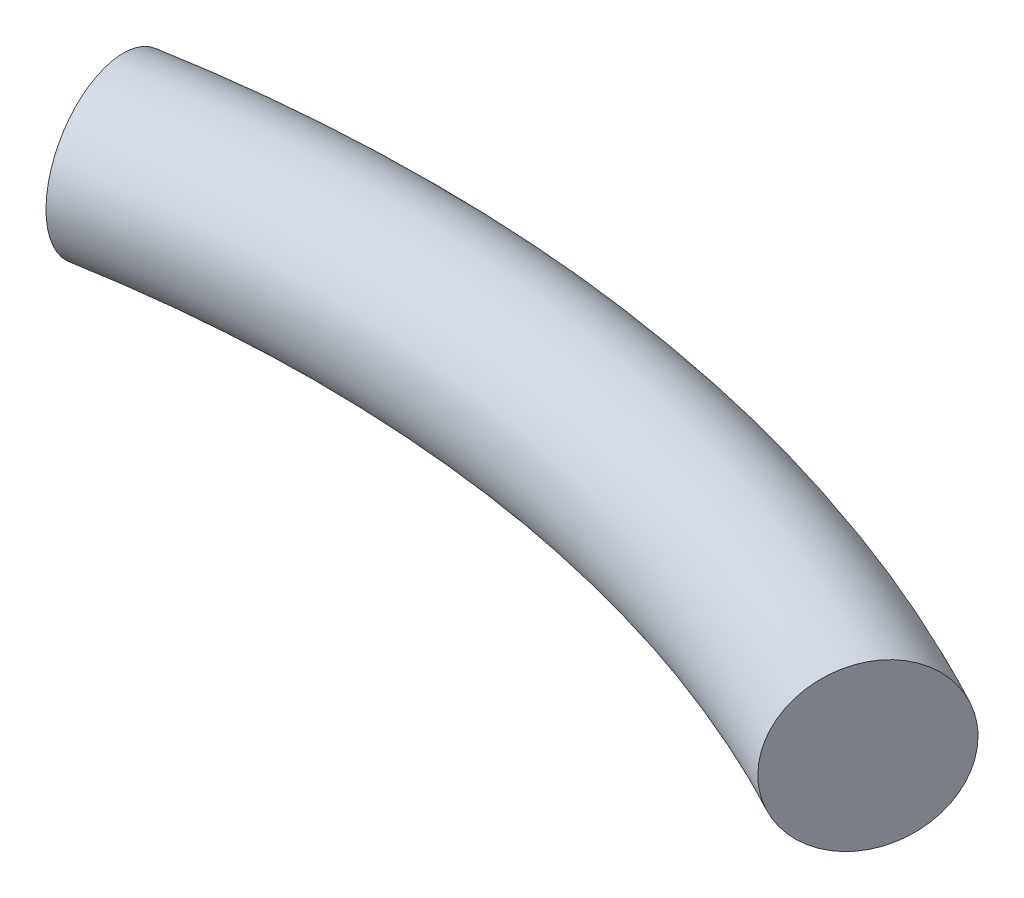
ISO-10303-21;
HEADER;
FILE_DESCRIPTION(('STEP AP214'),'2;1');
FILE_NAME('part.step','',(''),(''),'','','');
FILE_SCHEMA(('AUTOMOTIVE_DESIGN { 1 0 10303 214 1 1 1 1 }'));
ENDSEC;
DATA;
#1=APPLICATION_CONTEXT('core data for automotive mechanical design processes');
#2=APPLICATION_PROTOCOL_DEFINITION('international standard','automotive_design',2000,#1);
#3=PRODUCT_CONTEXT('',#1,'mechanical');
#4=PRODUCT('Part','Part','',(#3));
#5=PRODUCT_RELATED_PRODUCT_CATEGORY('part','',(#4));
#6=PRODUCT_DEFINITION_FORMATION('','',#4);
#7=PRODUCT_DEFINITION_CONTEXT('part definition',#1,'design');
#8=PRODUCT_DEFINITION('design','',#6,#7);
#9=PRODUCT_DEFINITION_SHAPE('','',#8);
#10=(LENGTH_UNIT() NAMED_UNIT(*) SI_UNIT(.MILLI.,.METRE.));
#11=(NAMED_UNIT(*) PLANE_ANGLE_UNIT() SI_UNIT($,.RADIAN.));
#12=(NAMED_UNIT(*) SI_UNIT($,.STERADIAN.) SOLID_ANGLE_UNIT());
#13=UNCERTAINTY_MEASURE_WITH_UNIT(LENGTH_MEASURE(1.E-05),#10,'distance_accuracy_value','');
#14=(GEOMETRIC_REPRESENTATION_CONTEXT(3) GLOBAL_UNCERTAINTY_ASSIGNED_CONTEXT((#13)) GLOBAL_UNIT_ASSIGNED_CONTEXT((#10,
#11,#12)) REPRESENTATION_CONTEXT('',''));
#15=CARTESIAN_POINT('',(0.,0.,0.));
#16=DIRECTION('',(0.,0.,1.));
#17=DIRECTION('',(1.,0.,0.));
#18=AXIS2_PLACEMENT_3D('',#15,#16,#17);
#19=CARTESIAN_POINT('',(0.,6.,0.));
#20=DIRECTION('',(-0.984807753012213,0.,0.173648177666902));
#21=DIRECTION('',(0.173648177666902,0.,0.984807753012213));
#22=AXIS2_PLACEMENT_3D('',#19,#20,#21);
#23=PLANE('',#22);
#24=CARTESIAN_POINT('',(-1.26106359712091,0.7302,-7.15184705173472));
#25=CARTESIAN_POINT('',(-1.26106327662223,0.75265524155964,-7.15184523409641));
#26=CARTESIAN_POINT('',(-1.26073403933574,0.775130857259379,-7.1499780366592));
#27=CARTESIAN_POINT('',(-1.25942422654595,0.819482451297505,-7.14254971919732));
#28=CARTESIAN_POINT('',(-1.25844225703204,0.841357041711003,-7.13698069334567));
#29=CARTESIAN_POINT('',(-1.25585623468071,0.883809618347233,-7.12231463179948));
#30=CARTESIAN_POINT('',(-1.25425329215272,0.904389843003349,-7.11322389298259));
#31=CARTESIAN_POINT('',(-1.25046785263389,0.943737337222425,-7.09175559866015));
#32=CARTESIAN_POINT('',(-1.24828453348019,0.962501982989582,-7.07937338043739));
#33=CARTESIAN_POINT('',(-1.24340496630295,0.997627484938171,-7.05169997981749));
#34=CARTESIAN_POINT('',(-1.24070944588194,1.01399169330263,-7.03641292385937));
#35=CARTESIAN_POINT('',(-1.23487576725396,1.0439048849067,-7.00332848831499));
#36=CARTESIAN_POINT('',(-1.23173699468016,1.05744989503907,-6.98552762448131));
#37=CARTESIAN_POINT('',(-1.22511134048583,1.08130194187445,-6.94795167230596));
#38=CARTESIAN_POINT('',(-1.22162471407894,1.09161132980011,-6.92817803135275));
#39=CARTESIAN_POINT('',(-1.21440018706302,1.10871348302438,-6.887205702632));
#40=CARTESIAN_POINT('',(-1.21066227168595,1.11550604143746,-6.86600693111075));
#41=CARTESIAN_POINT('',(-1.20304158246565,1.12538061292917,-6.8227878548827));
#42=CARTESIAN_POINT('',(-1.19915881288573,1.12846273512374,-6.80076757435434));
#43=CARTESIAN_POINT('',(-1.19135853067205,1.1308293161772,-6.75652997564802));
#44=CARTESIAN_POINT('',(-1.1874410180383,1.13011377503607,-6.73431265747006));
#45=CARTESIAN_POINT('',(-1.17968234063501,1.12490525493437,-6.69031101136852));
#46=CARTESIAN_POINT('',(-1.17584117811422,1.12041216488209,-6.66852669619815));
#47=CARTESIAN_POINT('',(-1.16834459228121,1.10777635092602,-6.62601144525419));
#48=CARTESIAN_POINT('',(-1.16468915805763,1.09963384169881,-6.6052804475992));
#49=CARTESIAN_POINT('',(-1.15766496832465,1.07992311451522,-6.56544428806902));
#50=CARTESIAN_POINT('',(-1.15429642371465,1.06835240391896,-6.54634032226375));
#51=CARTESIAN_POINT('',(-1.14794923103057,1.04213485030234,-6.5103436037889));
#52=CARTESIAN_POINT('',(-1.14497004448574,1.02749233015651,-6.49344779729995));
#53=CARTESIAN_POINT('',(-1.13947657535798,0.99551397474831,-6.46229278570906));
#54=CARTESIAN_POINT('',(-1.13696295518431,0.97817436557765,-6.4480373373167));
#55=CARTESIAN_POINT('',(-1.13248052046677,0.941335318357767,-6.42261618679547));
#56=CARTESIAN_POINT('',(-1.13051093618635,0.921838987081607,-6.41144611927374));
#57=CARTESIAN_POINT('',(-1.12716462212538,0.881186262625342,-6.39246822917698));
#58=CARTESIAN_POINT('',(-1.12578895566426,0.8600269715397,-6.38466643698621));
#59=CARTESIAN_POINT('',(-1.12367713591127,0.81671349003598,-6.37268971201473));
#60=CARTESIAN_POINT('',(-1.12293962165056,0.794561523394872,-6.36850706079628));
#61=CARTESIAN_POINT('',(-1.12227321677924,0.758269762147005,-6.36472769096509));
#62=CARTESIAN_POINT('',(-1.12214485461382,0.744238862857464,-6.36399971294996));
#63=CARTESIAN_POINT('',(-1.12214537548606,0.70774475844036,-6.36400266696325));
#64=CARTESIAN_POINT('',(-1.12247461277255,0.685269142740621,-6.36586986440046));
#65=CARTESIAN_POINT('',(-1.12378442556235,0.640917548702496,-6.37329818186234));
#66=CARTESIAN_POINT('',(-1.12476639507626,0.619042958288997,-6.37886720771399));
#67=CARTESIAN_POINT('',(-1.12735241742758,0.576590381652767,-6.39353326926018));
#68=CARTESIAN_POINT('',(-1.12895535995557,0.556010156996652,-6.40262400807707));
#69=CARTESIAN_POINT('',(-1.13274079947441,0.516662662777576,-6.42409230239951));
#70=CARTESIAN_POINT('',(-1.1349241186281,0.497898017010418,-6.43647452062227));
#71=CARTESIAN_POINT('',(-1.13980368580534,0.46277251506183,-6.46414792124218));
#72=CARTESIAN_POINT('',(-1.14249920622636,0.44640830669737,-6.47943497720029));
#73=CARTESIAN_POINT('',(-1.14833288485434,0.416495115093302,-6.51251941274467));
#74=CARTESIAN_POINT('',(-1.15147165742813,0.40295010496093,-6.53032027657835));
#75=CARTESIAN_POINT('',(-1.15809731162246,0.379098058125552,-6.5678962287537));
#76=CARTESIAN_POINT('',(-1.16158393802935,0.368788670199896,-6.58766986970691));
#77=CARTESIAN_POINT('',(-1.16880846504528,0.351686516975622,-6.62864219842766));
#78=CARTESIAN_POINT('',(-1.17254638042234,0.344893958562538,-6.64984096994891));
#79=CARTESIAN_POINT('',(-1.18016706964264,0.335019387070832,-6.69306004617696));
#80=CARTESIAN_POINT('',(-1.18404983922256,0.331937264876257,-6.71508032670532));
#81=CARTESIAN_POINT('',(-1.19185012143624,0.329570683822803,-6.75931792541164));
#82=CARTESIAN_POINT('',(-1.19576763407,0.330286224963925,-6.7815352435896));
#83=CARTESIAN_POINT('',(-1.20352631147328,0.335494745065634,-6.82553688969114));
#84=CARTESIAN_POINT('',(-1.20736747399408,0.339987835117909,-6.84732120486151));
#85=CARTESIAN_POINT('',(-1.21486405982709,0.352623649073976,-6.88983645580547));
#86=CARTESIAN_POINT('',(-1.21851949405066,0.360766158301187,-6.91056745346046));
#87=CARTESIAN_POINT('',(-1.22554368378364,0.380476885484782,-6.95040361299063));
#88=CARTESIAN_POINT('',(-1.22891222839364,0.392047596081043,-6.96950757879591));
#89=CARTESIAN_POINT('',(-1.23525942107772,0.418265149697662,-7.00550429727076));
#90=CARTESIAN_POINT('',(-1.23823860762255,0.432907669843493,-7.02240010375971));
#91=CARTESIAN_POINT('',(-1.24373207675031,0.46488602525169,-7.0535551153506));
#92=CARTESIAN_POINT('',(-1.24624569692398,0.482225634422349,-7.06781056374296));
#93=CARTESIAN_POINT('',(-1.25072813164153,0.519064681642232,-7.09323171426419));
#94=CARTESIAN_POINT('',(-1.25269771592194,0.538561012918391,-7.10440178178592));
#95=CARTESIAN_POINT('',(-1.25604402998292,0.579213737374657,-7.12337967188268));
#96=CARTESIAN_POINT('',(-1.25741969644403,0.600373028460299,-7.13118146407345));
#97=CARTESIAN_POINT('',(-1.25953151619703,0.643686509964019,-7.14315818904493));
#98=CARTESIAN_POINT('',(-1.26026903045773,0.665838476605128,-7.14734084026338));
#99=CARTESIAN_POINT('',(-1.26093543532905,0.702130237852995,-7.15112021009458));
#100=CARTESIAN_POINT('',(-1.26106379749448,0.716161137142536,-7.1518481881097));
#101=CARTESIAN_POINT('',(-1.26106359712091,0.7302,-7.15184705173472));
#102=B_SPLINE_CURVE_WITH_KNOTS('',3,(#24,#25,#26,#27,#28,#29,#30,#31,#32,#33,#34,#35,#36,#37,
#38,#39,#40,#41,#42,#43,#44,#45,#46,#47,#48,#49,#50,#51,#52,#53,#54,#55,#56,#57,#58,#59,#60,#61,
#62,#63,#64,#65,#66,#67,#68,#69,#70,#71,#72,#73,#74,#75,#76,#77,#78,#79,#80,#81,#82,#83,#84,#85,
#86,#87,#88,#89,#90,#91,#92,#93,#94,#95,#96,#97,#98,#99,#100,#101),.UNSPECIFIED.,.T.,.F.,(4,2,2,
2,2,2,2,2,2,2,2,2,2,2,2,2,2,2,2,2,2,2,2,2,2,2,2,2,2,2,2,2,2,2,2,2,2,2,4),(0.,0.0673217190940753,
0.134787678055461,0.202133559490899,0.269575356418626,0.336922056232695,0.40436303479347,
0.471754892083668,0.539150713403567,0.606544552708823,0.673938392014079,0.741334213333978,
0.808726070624175,0.876167049184949,0.943513748999018,1.01095554592846,1.07830142736561,
1.14576738632871,1.2130891054245,1.25517818200736,1.32249990110144,1.38996586006282,
1.45731174149826,1.52475353842599,1.59210023824006,1.65954121680083,1.72693307409103,
1.79432889541093,1.86172273471618,1.92911657402144,1.99651239534134,2.06390425263153,
2.13134523119231,2.19869193100638,2.26613372793582,2.33347960937297,2.40094556833607,
2.46826728743186,2.51035636401472),.UNSPECIFIED.);
#103=CARTESIAN_POINT('',(-1.26106359712091,0.7302,-7.15184705173472));
#104=VERTEX_POINT('',#103);
#105=EDGE_CURVE('E18',#104,#104,#102,.T.);
#106=ORIENTED_EDGE('',*,*,#105,.F.);
#107=EDGE_LOOP('',(#106));
#108=FACE_BOUND('',#107,.T.);
#109=ADVANCED_FACE('F14',(#108),#23,.T.);
#110=CARTESIAN_POINT('',(0.,6.,0.));
#111=DIRECTION('',(-0.882947592858917,0.,-0.469471562785909));
#112=DIRECTION('',(-0.469471562785909,0.,0.882947592858917));
#113=AXIS2_PLACEMENT_3D('',#110,#111,#112);
#114=PLANE('',#113);
#115=CARTESIAN_POINT('',(3.03380778143243,0.7302,-5.70576258531332));
#116=CARTESIAN_POINT('',(3.03380864792591,0.75265524155964,-5.70576421495053));
#117=CARTESIAN_POINT('',(3.03469876693258,0.775130857259379,-5.7074382853237));
#118=CARTESIAN_POINT('',(3.03823994925677,0.819482451297505,-5.71409828063943));
#119=CARTESIAN_POINT('',(3.04089478139206,0.841357041711003,-5.7190912936973));
#120=CARTESIAN_POINT('',(3.04788629705889,0.883809618347233,-5.73224042224479));
#121=CARTESIAN_POINT('',(3.05221997878123,0.904389843003349,-5.74039089215239));
#122=CARTESIAN_POINT('',(3.06245421348853,0.943737337222425,-5.75963868821899));
#123=CARTESIAN_POINT('',(3.0683569892557,0.962501982989582,-5.77074019482329));
#124=CARTESIAN_POINT('',(3.08154928450001,0.99762748493817,-5.79555129362793));
#125=CARTESIAN_POINT('',(3.08883683684625,1.01399169330263,-5.80925718619309));
#126=CARTESIAN_POINT('',(3.10460864775187,1.0439048849067,-5.83891964836975));
#127=CARTESIAN_POINT('',(3.11309456730051,1.05744989503907,-5.85487934184768));
#128=CARTESIAN_POINT('',(3.13100754669875,1.08130194187445,-5.88856875627514));
#129=CARTESIAN_POINT('',(3.14043391655812,1.0916113298001,-5.9062971795418));
#130=CARTESIAN_POINT('',(3.1599659959276,1.10871348302438,-5.94303167813522));
#131=CARTESIAN_POINT('',(3.17007174536425,1.11550604143746,-5.9620378285529));
#132=CARTESIAN_POINT('',(3.19067488054154,1.12538061292917,-6.00078669014992));
#133=CARTESIAN_POINT('',(3.20117225475596,1.12846273512374,-6.02052937965163));
#134=CARTESIAN_POINT('',(3.22226093377482,1.1308293161772,-6.06019141640158));
#135=CARTESIAN_POINT('',(3.23285223857925,1.13011377503608,-6.08011076364982));
#136=CARTESIAN_POINT('',(3.25382843570733,1.12490525493437,-6.11956125273091));
#137=CARTESIAN_POINT('',(3.26421332195134,1.12041216488209,-6.13909238312964));
#138=CARTESIAN_POINT('',(3.28448093381959,1.10777635092602,-6.17721021715963));
#139=CARTESIAN_POINT('',(3.29436368894355,1.09963384169881,-6.1957969762718));
#140=CARTESIAN_POINT('',(3.31335414064624,1.07992311451522,-6.23151282137794));
#141=CARTESIAN_POINT('',(3.32246126704181,1.06835240391896,-6.24864083501333));
#142=CARTESIAN_POINT('',(3.33962140375465,1.04213485030234,-6.28091435827811));
#143=CARTESIAN_POINT('',(3.34767586987013,1.02749233015651,-6.29606260586573));
#144=CARTESIAN_POINT('',(3.36252789752268,0.99551397474831,-6.32399520733594));
#145=CARTESIAN_POINT('',(3.36932366818401,0.978174365577649,-6.33677619307114));
#146=CARTESIAN_POINT('',(3.38144228445862,0.941335318357766,-6.35956799542218));
#147=CARTESIAN_POINT('',(3.38676721111544,0.921838987081608,-6.36958272591167));
#148=CARTESIAN_POINT('',(3.39581423546598,0.881186262625343,-6.38659770404037));
#149=CARTESIAN_POINT('',(3.3995334583916,0.8600269715397,-6.39359254502711));
#150=CARTESIAN_POINT('',(3.40524292988207,0.81671349003598,-6.40433049916237));
#151=CARTESIAN_POINT('',(3.40723685793362,0.794561523394871,-6.40808053241892));
#152=CARTESIAN_POINT('',(3.40903853613485,0.758269762147005,-6.411468996294));
#153=CARTESIAN_POINT('',(3.40938557338693,0.744238862857464,-6.41212167843845));
#154=CARTESIAN_POINT('',(3.40938416516768,0.70774475844036,-6.41211902996324));
#155=CARTESIAN_POINT('',(3.408494046161,0.685269142740621,-6.41044495959007));
#156=CARTESIAN_POINT('',(3.4049528638368,0.640917548702496,-6.40378496427434));
#157=CARTESIAN_POINT('',(3.40229803170152,0.619042958288997,-6.39879195121647));
#158=CARTESIAN_POINT('',(3.39530651603469,0.576590381652767,-6.38564282266898));
#159=CARTESIAN_POINT('',(3.39097283431235,0.556010156996652,-6.37749235276138));
#160=CARTESIAN_POINT('',(3.38073859960505,0.516662662777576,-6.35824455669479));
#161=CARTESIAN_POINT('',(3.37483582383788,0.497898017010418,-6.34714305009048));
#162=CARTESIAN_POINT('',(3.36164352859356,0.46277251506183,-6.32233195128584));
#163=CARTESIAN_POINT('',(3.35435597624733,0.44640830669737,-6.30862605872068));
#164=CARTESIAN_POINT('',(3.33858416534171,0.416495115093302,-6.27896359654402));
#165=CARTESIAN_POINT('',(3.33009824579307,0.40295010496093,-6.2630039030661));
#166=CARTESIAN_POINT('',(3.31218526639483,0.379098058125553,-6.22931448863863));
#167=CARTESIAN_POINT('',(3.30275889653546,0.368788670199896,-6.21158606537197));
#168=CARTESIAN_POINT('',(3.28322681716598,0.351686516975622,-6.17485156677855));
#169=CARTESIAN_POINT('',(3.27312106772932,0.344893958562539,-6.15584541636088));
#170=CARTESIAN_POINT('',(3.25251793255203,0.335019387070832,-6.11709655476385));
#171=CARTESIAN_POINT('',(3.24202055833761,0.331937264876257,-6.09735386526214));
#172=CARTESIAN_POINT('',(3.22093187931876,0.329570683822803,-6.05769182851219));
#173=CARTESIAN_POINT('',(3.21034057451434,0.330286224963925,-6.03777248126395));
#174=CARTESIAN_POINT('',(3.18936437738626,0.335494745065634,-5.99832199218285));
#175=CARTESIAN_POINT('',(3.17897949114224,0.339987835117909,-5.97879086178413));
#176=CARTESIAN_POINT('',(3.15871187927399,0.352623649073976,-5.94067302775415));
#177=CARTESIAN_POINT('',(3.14882912415003,0.360766158301187,-5.92208626864197));
#178=CARTESIAN_POINT('',(3.12983867244734,0.380476885484782,-5.88637042353583));
#179=CARTESIAN_POINT('',(3.12073154605177,0.392047596081043,-5.86924240990045));
#180=CARTESIAN_POINT('',(3.10357140933894,0.418265149697661,-5.83696888663566));
#181=CARTESIAN_POINT('',(3.09551694322346,0.432907669843492,-5.82182063904804));
#182=CARTESIAN_POINT('',(3.0806649155709,0.464886025251689,-5.79388803757783));
#183=CARTESIAN_POINT('',(3.07386914490957,0.482225634422348,-5.78110705184263));
#184=CARTESIAN_POINT('',(3.06175052863496,0.519064681642231,-5.75831524949159));
#185=CARTESIAN_POINT('',(3.05642560197815,0.538561012918391,-5.7483005190021));
#186=CARTESIAN_POINT('',(3.04737857762761,0.579213737374657,-5.7312855408734));
#187=CARTESIAN_POINT('',(3.04365935470198,0.600373028460298,-5.72429069988666));
#188=CARTESIAN_POINT('',(3.03794988321151,0.643686509964019,-5.7135527457514));
#189=CARTESIAN_POINT('',(3.03595595515996,0.665838476605127,-5.70980271249485));
#190=CARTESIAN_POINT('',(3.03415427695874,0.702130237852995,-5.70641424861977));
#191=CARTESIAN_POINT('',(3.03380723970666,0.716161137142536,-5.70576156647532));
#192=CARTESIAN_POINT('',(3.03380778143243,0.7302,-5.70576258531332));
#193=B_SPLINE_CURVE_WITH_KNOTS('',3,(#115,#116,#117,#118,#119,#120,#121,#122,#123,#124,#125,
#126,#127,#128,#129,#130,#131,#132,#133,#134,#135,#136,#137,#138,#139,#140,#141,#142,#143,#144,
#145,#146,#147,#148,#149,#150,#151,#152,#153,#154,#155,#156,#157,#158,#159,#160,#161,#162,#163,
#164,#165,#166,#167,#168,#169,#170,#171,#172,#173,#174,#175,#176,#177,#178,#179,#180,#181,#182,
#183,#184,#185,#186,#187,#188,#189,#190,#191,#192),.UNSPECIFIED.,.T.,.F.,(4,2,2,2,2,2,2,2,2,2,2,
2,2,2,2,2,2,2,2,2,2,2,2,2,2,2,2,2,2,2,2,2,2,2,2,2,2,2,4),(0.,0.0673217190940753,
0.134787678055462,0.202133559490899,0.269575356418625,0.336922056232694,0.404363034793469,
0.471754892083666,0.539150713403564,0.60654455270882,0.673938392014077,0.741334213333976,
0.808726070624173,0.876167049184948,0.943513748999019,1.01095554592846,1.07830142736561,
1.14576738632871,1.2130891054245,1.25517818200736,1.32249990110144,1.38996586006282,
1.45731174149826,1.52475353842599,1.59210023824006,1.65954121680083,1.72693307409103,
1.79432889541093,1.86172273471618,1.92911657402144,1.99651239534134,2.06390425263154,
2.13134523119231,2.19869193100638,2.26613372793582,2.33347960937297,2.40094556833607,
2.46826728743186,2.51035636401472),.UNSPECIFIED.);
#194=CARTESIAN_POINT('',(3.03380778143243,0.7302,-5.70576258531332));
#195=VERTEX_POINT('',#194);
#196=EDGE_CURVE('E10',#195,#195,#193,.T.);
#197=ORIENTED_EDGE('',*,*,#196,.F.);
#198=EDGE_LOOP('',(#197));
#199=FACE_BOUND('',#198,.T.);
#200=ADVANCED_FACE('F34',(#199),#114,.F.);
#201=CARTESIAN_POINT('',(0.,0.7302,0.));
#202=DIRECTION('',(0.,-1.,0.));
#203=DIRECTION('',(-0.984807753012213,0.,0.173648177666902));
#204=AXIS2_PLACEMENT_3D('',#201,#202,#203);
#205=TOROIDAL_SURFACE('',#204,6.862175820468,0.4);
#206=ORIENTED_EDGE('',*,*,#196,.T.);
#207=EDGE_LOOP('',(#206));
#208=FACE_BOUND('',#207,.T.);
#209=ORIENTED_EDGE('',*,*,#105,.T.);
#210=EDGE_LOOP('',(#209));
#211=FACE_BOUND('',#210,.T.);
#212=ADVANCED_FACE('F36',(#208,#211),#205,.T.);
#213=CLOSED_SHELL('',(#109,#200,#212));
#214=MANIFOLD_SOLID_BREP('B1',#213);
#215=ADVANCED_BREP_SHAPE_REPRESENTATION('',(#18,#214),#14);
#216=SHAPE_DEFINITION_REPRESENTATION(#9,#215);
ENDSEC;
END-ISO-10303-21;
